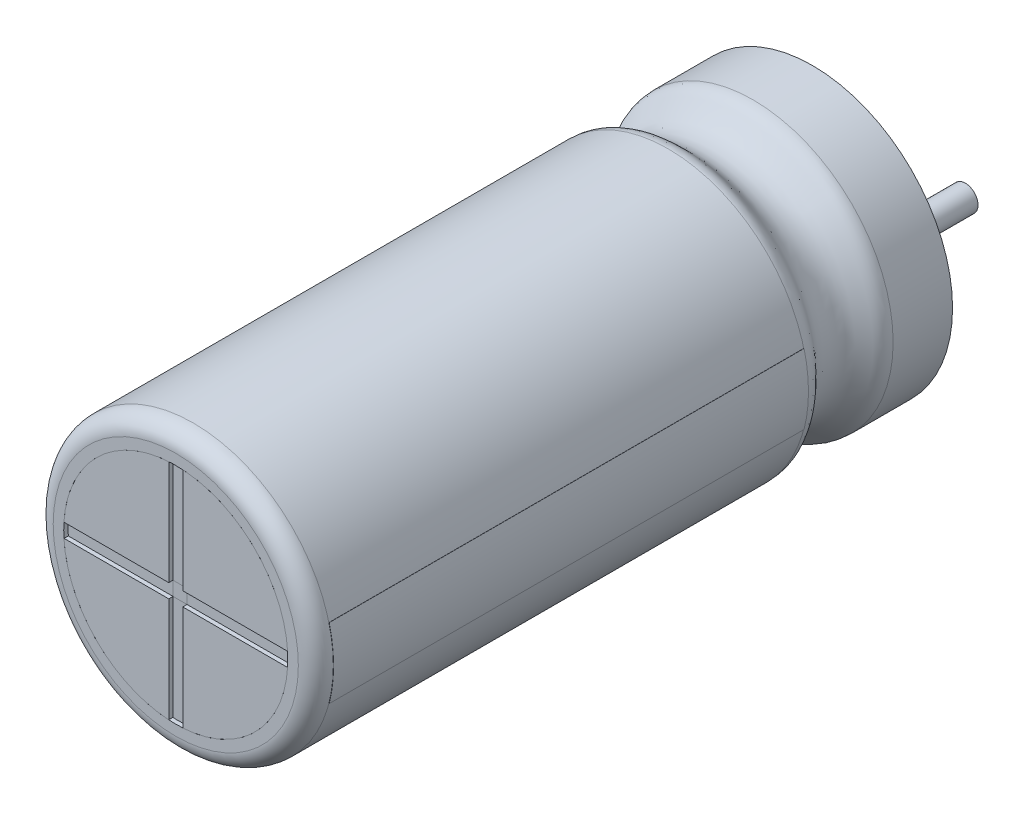
ISO-10303-21;
HEADER;
FILE_DESCRIPTION(('STEP AP214'),'2;1');
FILE_NAME('part.step','',(''),(''),'','','');
FILE_SCHEMA(('AUTOMOTIVE_DESIGN { 1 0 10303 214 1 1 1 1 }'));
ENDSEC;
DATA;
#1=APPLICATION_CONTEXT('core data for automotive mechanical design processes');
#2=APPLICATION_PROTOCOL_DEFINITION('international standard','automotive_design',2000,#1);
#3=PRODUCT_CONTEXT('',#1,'mechanical');
#4=PRODUCT('Part','Part','',(#3));
#5=PRODUCT_RELATED_PRODUCT_CATEGORY('part','',(#4));
#6=PRODUCT_DEFINITION_FORMATION('','',#4);
#7=PRODUCT_DEFINITION_CONTEXT('part definition',#1,'design');
#8=PRODUCT_DEFINITION('design','',#6,#7);
#9=PRODUCT_DEFINITION_SHAPE('','',#8);
#10=(LENGTH_UNIT() NAMED_UNIT(*) SI_UNIT(.MILLI.,.METRE.));
#11=(NAMED_UNIT(*) PLANE_ANGLE_UNIT() SI_UNIT($,.RADIAN.));
#12=(NAMED_UNIT(*) SI_UNIT($,.STERADIAN.) SOLID_ANGLE_UNIT());
#13=UNCERTAINTY_MEASURE_WITH_UNIT(LENGTH_MEASURE(1.E-05),#10,'distance_accuracy_value','');
#14=(GEOMETRIC_REPRESENTATION_CONTEXT(3) GLOBAL_UNCERTAINTY_ASSIGNED_CONTEXT((#13)) GLOBAL_UNIT_ASSIGNED_CONTEXT((#10,
#11,#12)) REPRESENTATION_CONTEXT('',''));
#15=CARTESIAN_POINT('',(0.,0.,0.));
#16=DIRECTION('',(0.,0.,1.));
#17=DIRECTION('',(1.,0.,0.));
#18=AXIS2_PLACEMENT_3D('',#15,#16,#17);
#19=CARTESIAN_POINT('',(-1.,0.,0.));
#20=DIRECTION('',(0.,0.,-1.));
#21=DIRECTION('',(0.,-1.,0.));
#22=AXIS2_PLACEMENT_3D('',#19,#20,#21);
#23=PLANE('',#22);
#24=CARTESIAN_POINT('',(-1.,0.,0.));
#25=DIRECTION('',(0.,0.,-1.));
#26=DIRECTION('',(-1.,0.,0.));
#27=AXIS2_PLACEMENT_3D('',#24,#25,#26);
#28=CIRCLE('',#27,0.25);
#29=CARTESIAN_POINT('',(-1.25,0.,0.));
#30=VERTEX_POINT('',#29);
#31=EDGE_CURVE('P0_E11',#30,#30,#28,.T.);
#32=ORIENTED_EDGE('',*,*,#31,.F.);
#33=EDGE_LOOP('',(#32));
#34=FACE_BOUND('',#33,.T.);
#35=ADVANCED_FACE('P0_F16',(#34),#23,.F.);
#36=CARTESIAN_POINT('',(-1.,0.,-2.));
#37=DIRECTION('',(0.,0.,-1.));
#38=DIRECTION('',(0.,-1.,0.));
#39=AXIS2_PLACEMENT_3D('',#36,#37,#38);
#40=PLANE('',#39);
#41=CARTESIAN_POINT('',(-1.,0.,-2.));
#42=DIRECTION('',(0.,0.,-1.));
#43=DIRECTION('',(-1.,0.,0.));
#44=AXIS2_PLACEMENT_3D('',#41,#42,#43);
#45=CIRCLE('',#44,0.25);
#46=CARTESIAN_POINT('',(-1.25,0.,-2.));
#47=VERTEX_POINT('',#46);
#48=EDGE_CURVE('P0_E42',#47,#47,#45,.T.);
#49=ORIENTED_EDGE('',*,*,#48,.T.);
#50=EDGE_LOOP('',(#49));
#51=FACE_BOUND('',#50,.T.);
#52=ADVANCED_FACE('P0_F18',(#51),#40,.T.);
#53=CARTESIAN_POINT('',(-1.,0.,0.));
#54=DIRECTION('',(0.,0.,-1.));
#55=DIRECTION('',(-1.,0.,0.));
#56=AXIS2_PLACEMENT_3D('',#53,#54,#55);
#57=CYLINDRICAL_SURFACE('',#56,0.25);
#58=ORIENTED_EDGE('',*,*,#48,.F.);
#59=DIRECTION('',(0.,0.,-1.));
#60=VECTOR('',#59,1.);
#61=CARTESIAN_POINT('',(-1.25,0.,0.));
#62=LINE('',#61,#60);
#63=EDGE_CURVE('P0_E20',#30,#47,#62,.T.);
#64=ORIENTED_EDGE('',*,*,#63,.F.);
#65=ORIENTED_EDGE('',*,*,#31,.T.);
#66=ORIENTED_EDGE('',*,*,#63,.T.);
#67=EDGE_LOOP('',(#58,#64,#65,#66));
#68=FACE_BOUND('',#67,.T.);
#69=ADVANCED_FACE('P0_F41',(#68),#57,.T.);
#70=CLOSED_SHELL('',(#35,#52,#69));
#71=MANIFOLD_SOLID_BREP('P0_B1',#70);
#72=CARTESIAN_POINT('',(1.,0.,0.));
#73=DIRECTION('',(0.,0.,-1.));
#74=DIRECTION('',(0.,-1.,0.));
#75=AXIS2_PLACEMENT_3D('',#72,#73,#74);
#76=PLANE('',#75);
#77=CARTESIAN_POINT('',(1.,0.,0.));
#78=DIRECTION('',(0.,0.,-1.));
#79=DIRECTION('',(-1.,0.,0.));
#80=AXIS2_PLACEMENT_3D('',#77,#78,#79);
#81=CIRCLE('',#80,0.25);
#82=CARTESIAN_POINT('',(0.75,0.,0.));
#83=VERTEX_POINT('',#82);
#84=EDGE_CURVE('P1_E11',#83,#83,#81,.T.);
#85=ORIENTED_EDGE('',*,*,#84,.F.);
#86=EDGE_LOOP('',(#85));
#87=FACE_BOUND('',#86,.T.);
#88=ADVANCED_FACE('P1_F16',(#87),#76,.F.);
#89=CARTESIAN_POINT('',(1.,0.,-2.));
#90=DIRECTION('',(0.,0.,-1.));
#91=DIRECTION('',(0.,-1.,0.));
#92=AXIS2_PLACEMENT_3D('',#89,#90,#91);
#93=PLANE('',#92);
#94=CARTESIAN_POINT('',(1.,0.,-2.));
#95=DIRECTION('',(0.,0.,-1.));
#96=DIRECTION('',(-1.,0.,0.));
#97=AXIS2_PLACEMENT_3D('',#94,#95,#96);
#98=CIRCLE('',#97,0.25);
#99=CARTESIAN_POINT('',(0.75,0.,-2.));
#100=VERTEX_POINT('',#99);
#101=EDGE_CURVE('P1_E40',#100,#100,#98,.T.);
#102=ORIENTED_EDGE('',*,*,#101,.T.);
#103=EDGE_LOOP('',(#102));
#104=FACE_BOUND('',#103,.T.);
#105=ADVANCED_FACE('P1_F43',(#104),#93,.T.);
#106=CARTESIAN_POINT('',(1.,0.,0.));
#107=DIRECTION('',(0.,0.,-1.));
#108=DIRECTION('',(-1.,0.,0.));
#109=AXIS2_PLACEMENT_3D('',#106,#107,#108);
#110=CYLINDRICAL_SURFACE('',#109,0.25);
#111=ORIENTED_EDGE('',*,*,#101,.F.);
#112=DIRECTION('',(0.,0.,-1.));
#113=VECTOR('',#112,1.);
#114=CARTESIAN_POINT('',(0.75,0.,0.));
#115=LINE('',#114,#113);
#116=EDGE_CURVE('P1_E24',#83,#100,#115,.T.);
#117=ORIENTED_EDGE('',*,*,#116,.F.);
#118=ORIENTED_EDGE('',*,*,#84,.T.);
#119=ORIENTED_EDGE('',*,*,#116,.T.);
#120=EDGE_LOOP('',(#111,#117,#118,#119));
#121=FACE_BOUND('',#120,.T.);
#122=ADVANCED_FACE('P1_F39',(#121),#110,.T.);
#123=CLOSED_SHELL('',(#88,#105,#122));
#124=MANIFOLD_SOLID_BREP('P1_B1',#123);
#125=CARTESIAN_POINT('',(-0.1375,3.25,12.416666666667));
#126=DIRECTION('',(0.,0.,1.));
#127=DIRECTION('',(1.,0.,0.));
#128=AXIS2_PLACEMENT_3D('',#125,#126,#127);
#129=PLANE('',#128);
#130=DIRECTION('',(0.,-1.,0.));
#131=VECTOR('',#130,1.);
#132=CARTESIAN_POINT('',(0.1375,3.25,12.416666666667));
#133=LINE('',#132,#131);
#134=CARTESIAN_POINT('',(0.1375,0.1375,12.416666666667));
#135=VERTEX_POINT('',#134);
#136=CARTESIAN_POINT('',(0.1375,-0.1375,12.416666666667));
#137=VERTEX_POINT('',#136);
#138=EDGE_CURVE('P2_E121',#135,#137,#133,.T.);
#139=ORIENTED_EDGE('',*,*,#138,.F.);
#140=DIRECTION('',(1.,0.,0.));
#141=VECTOR('',#140,1.);
#142=CARTESIAN_POINT('',(-3.25,0.1375,12.416666666667));
#143=LINE('',#142,#141);
#144=CARTESIAN_POINT('',(-0.1375,0.1375,12.416666666667));
#145=VERTEX_POINT('',#144);
#146=EDGE_CURVE('P2_E97',#145,#135,#143,.T.);
#147=ORIENTED_EDGE('',*,*,#146,.F.);
#148=DIRECTION('',(0.,-1.,0.));
#149=VECTOR('',#148,1.);
#150=CARTESIAN_POINT('',(-0.1375,3.25,12.416666666667));
#151=LINE('',#150,#149);
#152=CARTESIAN_POINT('',(-0.1375,-0.1375,12.416666666667));
#153=VERTEX_POINT('',#152);
#154=EDGE_CURVE('P2_E11',#145,#153,#151,.T.);
#155=ORIENTED_EDGE('',*,*,#154,.T.);
#156=DIRECTION('',(1.,0.,0.));
#157=VECTOR('',#156,1.);
#158=CARTESIAN_POINT('',(-3.25,-0.1375,12.416666666667));
#159=LINE('',#158,#157);
#160=EDGE_CURVE('P2_E216',#153,#137,#159,.T.);
#161=ORIENTED_EDGE('',*,*,#160,.T.);
#162=EDGE_LOOP('',(#139,#147,#155,#161));
#163=FACE_BOUND('',#162,.T.);
#164=ADVANCED_FACE('P2_F16',(#163),#129,.T.);
#165=CARTESIAN_POINT('',(-3.25,-0.1375,12.416666666667));
#166=DIRECTION('',(0.,1.,0.));
#167=DIRECTION('',(1.,0.,0.));
#168=AXIS2_PLACEMENT_3D('',#165,#166,#167);
#169=PLANE('',#168);
#170=DIRECTION('',(1.,0.,0.));
#171=VECTOR('',#170,1.);
#172=CARTESIAN_POINT('',(-3.25,-0.1375,12.416666666667));
#173=LINE('',#172,#171);
#174=CARTESIAN_POINT('',(-2.195698920617,-0.1375,12.416666666667));
#175=VERTEX_POINT('',#174);
#176=EDGE_CURVE('P2_E27',#175,#153,#173,.T.);
#177=ORIENTED_EDGE('',*,*,#176,.F.);
#178=DIRECTION('',(0.,0.,1.));
#179=VECTOR('',#178,1.);
#180=CARTESIAN_POINT('',(-2.195698920617,-0.1375,11.5));
#181=LINE('',#180,#179);
#182=CARTESIAN_POINT('',(-2.195698920617,-0.1375,12.5));
#183=VERTEX_POINT('',#182);
#184=EDGE_CURVE('P2_E187',#175,#183,#181,.T.);
#185=ORIENTED_EDGE('',*,*,#184,.T.);
#186=DIRECTION('',(-1.,0.,0.));
#187=VECTOR('',#186,1.);
#188=CARTESIAN_POINT('',(-1.625,-0.1375,12.5));
#189=LINE('',#188,#187);
#190=CARTESIAN_POINT('',(-0.1375,-0.1375,12.5));
#191=VERTEX_POINT('',#190);
#192=EDGE_CURVE('P2_E197',#191,#183,#189,.T.);
#193=ORIENTED_EDGE('',*,*,#192,.F.);
#194=DIRECTION('',(0.,0.,-1.));
#195=VECTOR('',#194,1.);
#196=CARTESIAN_POINT('',(-0.1375,-0.1375,12.416666666667));
#197=LINE('',#196,#195);
#198=EDGE_CURVE('P2_E222',#191,#153,#197,.T.);
#199=ORIENTED_EDGE('',*,*,#198,.T.);
#200=EDGE_LOOP('',(#177,#185,#193,#199));
#201=FACE_BOUND('',#200,.T.);
#202=ADVANCED_FACE('P2_F331',(#201),#169,.T.);
#203=CARTESIAN_POINT('',(0.,0.,11.5));
#204=DIRECTION('',(0.,0.,1.));
#205=DIRECTION('',(1.,0.,0.));
#206=AXIS2_PLACEMENT_3D('',#203,#204,#205);
#207=PLANE('',#206);
#208=CARTESIAN_POINT('',(0.,0.,11.5));
#209=DIRECTION('',(0.,0.,1.));
#210=DIRECTION('',(-1.,0.,0.));
#211=AXIS2_PLACEMENT_3D('',#208,#209,#210);
#212=CIRCLE('',#211,2.2);
#213=CARTESIAN_POINT('',(-2.2,0.,11.5));
#214=VERTEX_POINT('',#213);
#215=EDGE_CURVE('P2_E195',#214,#214,#212,.T.);
#216=ORIENTED_EDGE('',*,*,#215,.F.);
#217=EDGE_LOOP('',(#216));
#218=FACE_BOUND('',#217,.T.);
#219=ADVANCED_FACE('P2_F337',(#218),#207,.F.);
#220=CARTESIAN_POINT('',(-3.25,-0.1375,12.416666666667));
#221=DIRECTION('',(0.,0.,1.));
#222=DIRECTION('',(1.,0.,0.));
#223=AXIS2_PLACEMENT_3D('',#220,#221,#222);
#224=PLANE('',#223);
#225=DIRECTION('',(1.,0.,0.));
#226=VECTOR('',#225,1.);
#227=CARTESIAN_POINT('',(-3.25,0.1375,12.416666666667));
#228=LINE('',#227,#226);
#229=CARTESIAN_POINT('',(-2.195698920617,0.1375,12.416666666667));
#230=VERTEX_POINT('',#229);
#231=EDGE_CURVE('P2_E202',#230,#145,#228,.T.);
#232=ORIENTED_EDGE('',*,*,#231,.F.);
#233=CARTESIAN_POINT('',(0.,0.,12.416666666667));
#234=DIRECTION('',(0.,0.,1.));
#235=DIRECTION('',(-1.,0.,0.));
#236=AXIS2_PLACEMENT_3D('',#233,#234,#235);
#237=CIRCLE('',#236,2.2);
#238=CARTESIAN_POINT('',(-2.2,0.,12.416666666667));
#239=VERTEX_POINT('',#238);
#240=EDGE_CURVE('P2_E243',#230,#239,#237,.T.);
#241=ORIENTED_EDGE('',*,*,#240,.T.);
#242=CARTESIAN_POINT('',(0.,0.,12.416666666667));
#243=DIRECTION('',(0.,0.,1.));
#244=DIRECTION('',(-1.,0.,0.));
#245=AXIS2_PLACEMENT_3D('',#242,#243,#244);
#246=CIRCLE('',#245,2.2);
#247=EDGE_CURVE('P2_E190',#239,#175,#246,.T.);
#248=ORIENTED_EDGE('',*,*,#247,.T.);
#249=ORIENTED_EDGE('',*,*,#176,.T.);
#250=ORIENTED_EDGE('',*,*,#154,.F.);
#251=EDGE_LOOP('',(#232,#241,#248,#249,#250));
#252=FACE_BOUND('',#251,.T.);
#253=ADVANCED_FACE('P2_F367',(#252),#224,.T.);
#254=CARTESIAN_POINT('',(-3.25,0.1375,12.416666666667));
#255=DIRECTION('',(0.,1.,0.));
#256=DIRECTION('',(1.,0.,0.));
#257=AXIS2_PLACEMENT_3D('',#254,#255,#256);
#258=PLANE('',#257);
#259=DIRECTION('',(0.,0.,-1.));
#260=VECTOR('',#259,1.);
#261=CARTESIAN_POINT('',(-0.1375,0.1375,12.416666666667));
#262=LINE('',#261,#260);
#263=CARTESIAN_POINT('',(-0.1375,0.1375,12.5));
#264=VERTEX_POINT('',#263);
#265=EDGE_CURVE('P2_E276',#264,#145,#262,.T.);
#266=ORIENTED_EDGE('',*,*,#265,.F.);
#267=DIRECTION('',(-1.,0.,0.));
#268=VECTOR('',#267,1.);
#269=CARTESIAN_POINT('',(-1.625,0.1375,12.5));
#270=LINE('',#269,#268);
#271=CARTESIAN_POINT('',(-2.195698920617,0.1375,12.5));
#272=VERTEX_POINT('',#271);
#273=EDGE_CURVE('P2_E20',#264,#272,#270,.T.);
#274=ORIENTED_EDGE('',*,*,#273,.T.);
#275=DIRECTION('',(0.,0.,1.));
#276=VECTOR('',#275,1.);
#277=CARTESIAN_POINT('',(-2.195698920617,0.1375,11.5));
#278=LINE('',#277,#276);
#279=EDGE_CURVE('P2_E236',#230,#272,#278,.T.);
#280=ORIENTED_EDGE('',*,*,#279,.F.);
#281=ORIENTED_EDGE('',*,*,#231,.T.);
#282=EDGE_LOOP('',(#266,#274,#280,#281));
#283=FACE_BOUND('',#282,.T.);
#284=ADVANCED_FACE('P2_F369',(#283),#258,.F.);
#285=CARTESIAN_POINT('',(0.,0.,12.5));
#286=DIRECTION('',(0.,0.,1.));
#287=DIRECTION('',(1.,0.,0.));
#288=AXIS2_PLACEMENT_3D('',#285,#286,#287);
#289=PLANE('',#288);
#290=DIRECTION('',(0.,1.,0.));
#291=VECTOR('',#290,1.);
#292=CARTESIAN_POINT('',(-0.1375,1.625,12.5));
#293=LINE('',#292,#291);
#294=CARTESIAN_POINT('',(-0.1375,2.195698920617,12.5));
#295=VERTEX_POINT('',#294);
#296=EDGE_CURVE('P2_E280',#264,#295,#293,.T.);
#297=ORIENTED_EDGE('',*,*,#296,.T.);
#298=CARTESIAN_POINT('',(0.,0.,12.5));
#299=DIRECTION('',(0.,0.,1.));
#300=DIRECTION('',(-1.,0.,0.));
#301=AXIS2_PLACEMENT_3D('',#298,#299,#300);
#302=CIRCLE('',#301,2.2);
#303=EDGE_CURVE('P2_E233',#295,#272,#302,.T.);
#304=ORIENTED_EDGE('',*,*,#303,.T.);
#305=ORIENTED_EDGE('',*,*,#273,.F.);
#306=EDGE_LOOP('',(#297,#304,#305));
#307=FACE_BOUND('',#306,.T.);
#308=ADVANCED_FACE('P2_F356',(#307),#289,.T.);
#309=CARTESIAN_POINT('',(-0.1375,3.25,12.416666666667));
#310=DIRECTION('',(1.,0.,0.));
#311=DIRECTION('',(0.,-1.,0.));
#312=AXIS2_PLACEMENT_3D('',#309,#310,#311);
#313=PLANE('',#312);
#314=ORIENTED_EDGE('',*,*,#265,.T.);
#315=DIRECTION('',(0.,-1.,0.));
#316=VECTOR('',#315,1.);
#317=CARTESIAN_POINT('',(-0.1375,3.25,12.416666666667));
#318=LINE('',#317,#316);
#319=CARTESIAN_POINT('',(-0.1375,2.195698920617,12.416666666667));
#320=VERTEX_POINT('',#319);
#321=EDGE_CURVE('P2_E239',#320,#145,#318,.T.);
#322=ORIENTED_EDGE('',*,*,#321,.F.);
#323=DIRECTION('',(0.,0.,1.));
#324=VECTOR('',#323,1.);
#325=CARTESIAN_POINT('',(-0.1375,2.195698920617,11.5));
#326=LINE('',#325,#324);
#327=EDGE_CURVE('P2_E183',#320,#295,#326,.T.);
#328=ORIENTED_EDGE('',*,*,#327,.T.);
#329=ORIENTED_EDGE('',*,*,#296,.F.);
#330=EDGE_LOOP('',(#314,#322,#328,#329));
#331=FACE_BOUND('',#330,.T.);
#332=ADVANCED_FACE('P2_F351',(#331),#313,.T.);
#333=CARTESIAN_POINT('',(-0.1375,3.25,12.416666666667));
#334=DIRECTION('',(0.,0.,1.));
#335=DIRECTION('',(1.,0.,0.));
#336=AXIS2_PLACEMENT_3D('',#333,#334,#335);
#337=PLANE('',#336);
#338=DIRECTION('',(0.,-1.,0.));
#339=VECTOR('',#338,1.);
#340=CARTESIAN_POINT('',(0.1375,3.25,12.416666666667));
#341=LINE('',#340,#339);
#342=CARTESIAN_POINT('',(0.1375,2.195698920617,12.416666666667));
#343=VERTEX_POINT('',#342);
#344=EDGE_CURVE('P2_E161',#343,#135,#341,.T.);
#345=ORIENTED_EDGE('',*,*,#344,.F.);
#346=CARTESIAN_POINT('',(0.,0.,12.416666666667));
#347=DIRECTION('',(0.,0.,1.));
#348=DIRECTION('',(-1.,0.,0.));
#349=AXIS2_PLACEMENT_3D('',#346,#347,#348);
#350=CIRCLE('',#349,2.2);
#351=EDGE_CURVE('P2_E177',#343,#320,#350,.T.);
#352=ORIENTED_EDGE('',*,*,#351,.T.);
#353=ORIENTED_EDGE('',*,*,#321,.T.);
#354=ORIENTED_EDGE('',*,*,#146,.T.);
#355=EDGE_LOOP('',(#345,#352,#353,#354));
#356=FACE_BOUND('',#355,.T.);
#357=ADVANCED_FACE('P2_F347',(#356),#337,.T.);
#358=CARTESIAN_POINT('',(0.1375,3.25,12.416666666667));
#359=DIRECTION('',(1.,0.,0.));
#360=DIRECTION('',(0.,-1.,0.));
#361=AXIS2_PLACEMENT_3D('',#358,#359,#360);
#362=PLANE('',#361);
#363=DIRECTION('',(0.,1.,0.));
#364=VECTOR('',#363,1.);
#365=CARTESIAN_POINT('',(0.1375,1.625,12.5));
#366=LINE('',#365,#364);
#367=CARTESIAN_POINT('',(0.1375,0.1375,12.5));
#368=VERTEX_POINT('',#367);
#369=CARTESIAN_POINT('',(0.1375,2.195698920617,12.5));
#370=VERTEX_POINT('',#369);
#371=EDGE_CURVE('P2_E151',#368,#370,#366,.T.);
#372=ORIENTED_EDGE('',*,*,#371,.T.);
#373=DIRECTION('',(0.,0.,1.));
#374=VECTOR('',#373,1.);
#375=CARTESIAN_POINT('',(0.1375,2.195698920617,11.5));
#376=LINE('',#375,#374);
#377=EDGE_CURVE('P2_E154',#343,#370,#376,.T.);
#378=ORIENTED_EDGE('',*,*,#377,.F.);
#379=ORIENTED_EDGE('',*,*,#344,.T.);
#380=DIRECTION('',(0.,0.,-1.));
#381=VECTOR('',#380,1.);
#382=CARTESIAN_POINT('',(0.1375,0.1375,12.416666666667));
#383=LINE('',#382,#381);
#384=EDGE_CURVE('P2_E157',#368,#135,#383,.T.);
#385=ORIENTED_EDGE('',*,*,#384,.F.);
#386=EDGE_LOOP('',(#372,#378,#379,#385));
#387=FACE_BOUND('',#386,.T.);
#388=ADVANCED_FACE('P2_F18',(#387),#362,.F.);
#389=CARTESIAN_POINT('',(0.,0.,12.5));
#390=DIRECTION('',(0.,0.,1.));
#391=DIRECTION('',(1.,0.,0.));
#392=AXIS2_PLACEMENT_3D('',#389,#390,#391);
#393=PLANE('',#392);
#394=DIRECTION('',(-1.,0.,0.));
#395=VECTOR('',#394,1.);
#396=CARTESIAN_POINT('',(-1.625,0.1375,12.5));
#397=LINE('',#396,#395);
#398=CARTESIAN_POINT('',(2.195698920617,0.1375,12.5));
#399=VERTEX_POINT('',#398);
#400=EDGE_CURVE('P2_E166',#399,#368,#397,.T.);
#401=ORIENTED_EDGE('',*,*,#400,.F.);
#402=CARTESIAN_POINT('',(0.,0.,12.5));
#403=DIRECTION('',(0.,0.,1.));
#404=DIRECTION('',(-1.,0.,0.));
#405=AXIS2_PLACEMENT_3D('',#402,#403,#404);
#406=CIRCLE('',#405,2.2);
#407=EDGE_CURVE('P2_E164',#399,#370,#406,.T.);
#408=ORIENTED_EDGE('',*,*,#407,.T.);
#409=ORIENTED_EDGE('',*,*,#371,.F.);
#410=EDGE_LOOP('',(#401,#408,#409));
#411=FACE_BOUND('',#410,.T.);
#412=ADVANCED_FACE('P2_F165',(#411),#393,.T.);
#413=CARTESIAN_POINT('',(-3.25,0.1375,12.416666666667));
#414=DIRECTION('',(0.,1.,0.));
#415=DIRECTION('',(1.,0.,0.));
#416=AXIS2_PLACEMENT_3D('',#413,#414,#415);
#417=PLANE('',#416);
#418=DIRECTION('',(0.,0.,1.));
#419=VECTOR('',#418,1.);
#420=CARTESIAN_POINT('',(2.195698920617,0.1375,11.5));
#421=LINE('',#420,#419);
#422=CARTESIAN_POINT('',(2.195698920617,0.1375,12.416666666667));
#423=VERTEX_POINT('',#422);
#424=EDGE_CURVE('P2_E171',#423,#399,#421,.T.);
#425=ORIENTED_EDGE('',*,*,#424,.T.);
#426=ORIENTED_EDGE('',*,*,#400,.T.);
#427=ORIENTED_EDGE('',*,*,#384,.T.);
#428=DIRECTION('',(1.,0.,0.));
#429=VECTOR('',#428,1.);
#430=CARTESIAN_POINT('',(-3.25,0.1375,12.416666666667));
#431=LINE('',#430,#429);
#432=EDGE_CURVE('P2_E232',#135,#423,#431,.T.);
#433=ORIENTED_EDGE('',*,*,#432,.T.);
#434=EDGE_LOOP('',(#425,#426,#427,#433));
#435=FACE_BOUND('',#434,.T.);
#436=ADVANCED_FACE('P2_F312',(#435),#417,.F.);
#437=CARTESIAN_POINT('',(-3.25,-0.1375,12.416666666667));
#438=DIRECTION('',(0.,0.,1.));
#439=DIRECTION('',(1.,0.,0.));
#440=AXIS2_PLACEMENT_3D('',#437,#438,#439);
#441=PLANE('',#440);
#442=ORIENTED_EDGE('',*,*,#432,.F.);
#443=ORIENTED_EDGE('',*,*,#138,.T.);
#444=DIRECTION('',(1.,0.,0.));
#445=VECTOR('',#444,1.);
#446=CARTESIAN_POINT('',(-3.25,-0.1375,12.416666666667));
#447=LINE('',#446,#445);
#448=CARTESIAN_POINT('',(2.195698920617,-0.1375,12.416666666667));
#449=VERTEX_POINT('',#448);
#450=EDGE_CURVE('P2_E228',#137,#449,#447,.T.);
#451=ORIENTED_EDGE('',*,*,#450,.T.);
#452=CARTESIAN_POINT('',(0.,0.,12.416666666667));
#453=DIRECTION('',(0.,0.,1.));
#454=DIRECTION('',(-1.,0.,0.));
#455=AXIS2_PLACEMENT_3D('',#452,#453,#454);
#456=CIRCLE('',#455,2.2);
#457=EDGE_CURVE('P2_E258',#449,#423,#456,.T.);
#458=ORIENTED_EDGE('',*,*,#457,.T.);
#459=EDGE_LOOP('',(#442,#443,#451,#458));
#460=FACE_BOUND('',#459,.T.);
#461=ADVANCED_FACE('P2_F315',(#460),#441,.T.);
#462=CARTESIAN_POINT('',(-3.25,-0.1375,12.416666666667));
#463=DIRECTION('',(0.,1.,0.));
#464=DIRECTION('',(1.,0.,0.));
#465=AXIS2_PLACEMENT_3D('',#462,#463,#464);
#466=PLANE('',#465);
#467=ORIENTED_EDGE('',*,*,#450,.F.);
#468=DIRECTION('',(0.,0.,-1.));
#469=VECTOR('',#468,1.);
#470=CARTESIAN_POINT('',(0.1375,-0.1375,12.416666666667));
#471=LINE('',#470,#469);
#472=CARTESIAN_POINT('',(0.1375,-0.1375,12.5));
#473=VERTEX_POINT('',#472);
#474=EDGE_CURVE('P2_E229',#473,#137,#471,.T.);
#475=ORIENTED_EDGE('',*,*,#474,.F.);
#476=DIRECTION('',(-1.,0.,0.));
#477=VECTOR('',#476,1.);
#478=CARTESIAN_POINT('',(-1.625,-0.1375,12.5));
#479=LINE('',#478,#477);
#480=CARTESIAN_POINT('',(2.195698920617,-0.1375,12.5));
#481=VERTEX_POINT('',#480);
#482=EDGE_CURVE('P2_E109',#481,#473,#479,.T.);
#483=ORIENTED_EDGE('',*,*,#482,.F.);
#484=DIRECTION('',(0.,0.,1.));
#485=VECTOR('',#484,1.);
#486=CARTESIAN_POINT('',(2.195698920617,-0.1375,11.5));
#487=LINE('',#486,#485);
#488=EDGE_CURVE('P2_E255',#449,#481,#487,.T.);
#489=ORIENTED_EDGE('',*,*,#488,.F.);
#490=EDGE_LOOP('',(#467,#475,#483,#489));
#491=FACE_BOUND('',#490,.T.);
#492=ADVANCED_FACE('P2_F317',(#491),#466,.T.);
#493=CARTESIAN_POINT('',(0.,0.,12.5));
#494=DIRECTION('',(0.,0.,1.));
#495=DIRECTION('',(1.,0.,0.));
#496=AXIS2_PLACEMENT_3D('',#493,#494,#495);
#497=PLANE('',#496);
#498=CARTESIAN_POINT('',(0.,0.,12.5));
#499=DIRECTION('',(0.,0.,1.));
#500=DIRECTION('',(-1.,0.,0.));
#501=AXIS2_PLACEMENT_3D('',#498,#499,#500);
#502=CIRCLE('',#501,2.2);
#503=CARTESIAN_POINT('',(0.1375,-2.195698920617,12.5));
#504=VERTEX_POINT('',#503);
#505=EDGE_CURVE('P2_E211',#504,#481,#502,.T.);
#506=ORIENTED_EDGE('',*,*,#505,.T.);
#507=ORIENTED_EDGE('',*,*,#482,.T.);
#508=DIRECTION('',(0.,1.,0.));
#509=VECTOR('',#508,1.);
#510=CARTESIAN_POINT('',(0.1375,1.625,12.5));
#511=LINE('',#510,#509);
#512=EDGE_CURVE('P2_E220',#504,#473,#511,.T.);
#513=ORIENTED_EDGE('',*,*,#512,.F.);
#514=EDGE_LOOP('',(#506,#507,#513));
#515=FACE_BOUND('',#514,.T.);
#516=ADVANCED_FACE('P2_F324',(#515),#497,.T.);
#517=CARTESIAN_POINT('',(0.1375,3.25,12.416666666667));
#518=DIRECTION('',(1.,0.,0.));
#519=DIRECTION('',(0.,-1.,0.));
#520=AXIS2_PLACEMENT_3D('',#517,#518,#519);
#521=PLANE('',#520);
#522=DIRECTION('',(0.,0.,1.));
#523=VECTOR('',#522,1.);
#524=CARTESIAN_POINT('',(0.1375,-2.195698920617,11.5));
#525=LINE('',#524,#523);
#526=CARTESIAN_POINT('',(0.1375,-2.195698920617,12.416666666667));
#527=VERTEX_POINT('',#526);
#528=EDGE_CURVE('P2_E206',#527,#504,#525,.T.);
#529=ORIENTED_EDGE('',*,*,#528,.T.);
#530=ORIENTED_EDGE('',*,*,#512,.T.);
#531=ORIENTED_EDGE('',*,*,#474,.T.);
#532=DIRECTION('',(0.,-1.,0.));
#533=VECTOR('',#532,1.);
#534=CARTESIAN_POINT('',(0.1375,3.25,12.416666666667));
#535=LINE('',#534,#533);
#536=EDGE_CURVE('P2_E221',#137,#527,#535,.T.);
#537=ORIENTED_EDGE('',*,*,#536,.T.);
#538=EDGE_LOOP('',(#529,#530,#531,#537));
#539=FACE_BOUND('',#538,.T.);
#540=ADVANCED_FACE('P2_F372',(#539),#521,.F.);
#541=CARTESIAN_POINT('',(-0.1375,3.25,12.416666666667));
#542=DIRECTION('',(0.,0.,1.));
#543=DIRECTION('',(1.,0.,0.));
#544=AXIS2_PLACEMENT_3D('',#541,#542,#543);
#545=PLANE('',#544);
#546=ORIENTED_EDGE('',*,*,#536,.F.);
#547=ORIENTED_EDGE('',*,*,#160,.F.);
#548=DIRECTION('',(0.,-1.,0.));
#549=VECTOR('',#548,1.);
#550=CARTESIAN_POINT('',(-0.1375,3.25,12.416666666667));
#551=LINE('',#550,#549);
#552=CARTESIAN_POINT('',(-0.1375,-2.195698920617,12.416666666667));
#553=VERTEX_POINT('',#552);
#554=EDGE_CURVE('P2_E200',#153,#553,#551,.T.);
#555=ORIENTED_EDGE('',*,*,#554,.T.);
#556=CARTESIAN_POINT('',(0.,0.,12.416666666667));
#557=DIRECTION('',(0.,0.,1.));
#558=DIRECTION('',(-1.,0.,0.));
#559=AXIS2_PLACEMENT_3D('',#556,#557,#558);
#560=CIRCLE('',#559,2.2);
#561=EDGE_CURVE('P2_E210',#553,#527,#560,.T.);
#562=ORIENTED_EDGE('',*,*,#561,.T.);
#563=EDGE_LOOP('',(#546,#547,#555,#562));
#564=FACE_BOUND('',#563,.T.);
#565=ADVANCED_FACE('P2_F341',(#564),#545,.T.);
#566=CARTESIAN_POINT('',(-0.1375,3.25,12.416666666667));
#567=DIRECTION('',(1.,0.,0.));
#568=DIRECTION('',(0.,-1.,0.));
#569=AXIS2_PLACEMENT_3D('',#566,#567,#568);
#570=PLANE('',#569);
#571=ORIENTED_EDGE('',*,*,#554,.F.);
#572=ORIENTED_EDGE('',*,*,#198,.F.);
#573=DIRECTION('',(0.,1.,0.));
#574=VECTOR('',#573,1.);
#575=CARTESIAN_POINT('',(-0.1375,1.625,12.5));
#576=LINE('',#575,#574);
#577=CARTESIAN_POINT('',(-0.1375,-2.195698920617,12.5));
#578=VERTEX_POINT('',#577);
#579=EDGE_CURVE('P2_E201',#578,#191,#576,.T.);
#580=ORIENTED_EDGE('',*,*,#579,.F.);
#581=DIRECTION('',(0.,0.,1.));
#582=VECTOR('',#581,1.);
#583=CARTESIAN_POINT('',(-0.1375,-2.195698920617,11.5));
#584=LINE('',#583,#582);
#585=EDGE_CURVE('P2_E212',#553,#578,#584,.T.);
#586=ORIENTED_EDGE('',*,*,#585,.F.);
#587=EDGE_LOOP('',(#571,#572,#580,#586));
#588=FACE_BOUND('',#587,.T.);
#589=ADVANCED_FACE('P2_F363',(#588),#570,.T.);
#590=CARTESIAN_POINT('',(0.,0.,12.5));
#591=DIRECTION('',(0.,0.,1.));
#592=DIRECTION('',(1.,0.,0.));
#593=AXIS2_PLACEMENT_3D('',#590,#591,#592);
#594=PLANE('',#593);
#595=ORIENTED_EDGE('',*,*,#579,.T.);
#596=ORIENTED_EDGE('',*,*,#192,.T.);
#597=CARTESIAN_POINT('',(0.,0.,12.5));
#598=DIRECTION('',(0.,0.,1.));
#599=DIRECTION('',(-1.,0.,0.));
#600=AXIS2_PLACEMENT_3D('',#597,#598,#599);
#601=CIRCLE('',#600,2.2);
#602=EDGE_CURVE('P2_E191',#183,#578,#601,.T.);
#603=ORIENTED_EDGE('',*,*,#602,.T.);
#604=EDGE_LOOP('',(#595,#596,#603));
#605=FACE_BOUND('',#604,.T.);
#606=ADVANCED_FACE('P2_F360',(#605),#594,.T.);
#607=CARTESIAN_POINT('',(0.,0.,11.5));
#608=DIRECTION('',(0.,0.,1.));
#609=DIRECTION('',(-1.,0.,0.));
#610=AXIS2_PLACEMENT_3D('',#607,#608,#609);
#611=CYLINDRICAL_SURFACE('',#610,2.2);
#612=ORIENTED_EDGE('',*,*,#602,.F.);
#613=ORIENTED_EDGE('',*,*,#184,.F.);
#614=ORIENTED_EDGE('',*,*,#247,.F.);
#615=DIRECTION('',(0.,0.,1.));
#616=VECTOR('',#615,1.);
#617=CARTESIAN_POINT('',(-2.2,0.,11.5));
#618=LINE('',#617,#616);
#619=EDGE_CURVE('P2_E192',#214,#239,#618,.T.);
#620=ORIENTED_EDGE('',*,*,#619,.F.);
#621=ORIENTED_EDGE('',*,*,#215,.T.);
#622=ORIENTED_EDGE('',*,*,#619,.T.);
#623=ORIENTED_EDGE('',*,*,#240,.F.);
#624=ORIENTED_EDGE('',*,*,#279,.T.);
#625=ORIENTED_EDGE('',*,*,#303,.F.);
#626=ORIENTED_EDGE('',*,*,#327,.F.);
#627=ORIENTED_EDGE('',*,*,#351,.F.);
#628=ORIENTED_EDGE('',*,*,#377,.T.);
#629=ORIENTED_EDGE('',*,*,#407,.F.);
#630=ORIENTED_EDGE('',*,*,#424,.F.);
#631=ORIENTED_EDGE('',*,*,#457,.F.);
#632=ORIENTED_EDGE('',*,*,#488,.T.);
#633=ORIENTED_EDGE('',*,*,#505,.F.);
#634=ORIENTED_EDGE('',*,*,#528,.F.);
#635=ORIENTED_EDGE('',*,*,#561,.F.);
#636=ORIENTED_EDGE('',*,*,#585,.T.);
#637=EDGE_LOOP('',(#612,#613,#614,#620,#621,#622,#623,#624,#625,#626,#627,#628,#629,#630,#631,
#632,#633,#634,#635,#636));
#638=FACE_BOUND('',#637,.T.);
#639=ADVANCED_FACE('P2_F174',(#638),#611,.T.);
#640=CLOSED_SHELL('',(#164,#202,#219,#253,#284,#308,#332,#357,#388,#412,#436,#461,#492,#516,
#540,#565,#589,#606,#639));
#641=MANIFOLD_SOLID_BREP('P2_B1',#640);
#642=CARTESIAN_POINT('',(0.,0.,11.25));
#643=DIRECTION('',(0.,0.,1.));
#644=DIRECTION('',(1.,0.,0.));
#645=AXIS2_PLACEMENT_3D('',#642,#643,#644);
#646=PLANE('',#645);
#647=CARTESIAN_POINT('',(0.,0.,11.25));
#648=DIRECTION('',(0.,0.,1.));
#649=DIRECTION('',(-1.,0.,0.));
#650=AXIS2_PLACEMENT_3D('',#647,#648,#649);
#651=CIRCLE('',#650,2.2);
#652=CARTESIAN_POINT('',(-2.2,0.,11.25));
#653=VERTEX_POINT('',#652);
#654=EDGE_CURVE('P3_E11',#653,#653,#651,.T.);
#655=ORIENTED_EDGE('',*,*,#654,.T.);
#656=EDGE_LOOP('',(#655));
#657=FACE_BOUND('',#656,.T.);
#658=ADVANCED_FACE('P3_F16',(#657),#646,.T.);
#659=CARTESIAN_POINT('',(0.,0.,11.25));
#660=DIRECTION('',(0.,0.,1.));
#661=DIRECTION('',(-1.,0.,0.));
#662=AXIS2_PLACEMENT_3D('',#659,#660,#661);
#663=CYLINDRICAL_SURFACE('',#662,2.2);
#664=DIRECTION('',(0.,0.,1.));
#665=VECTOR('',#664,1.);
#666=CARTESIAN_POINT('',(-2.2,0.,11.25));
#667=LINE('',#666,#665);
#668=CARTESIAN_POINT('',(-2.2,0.,12.5));
#669=VERTEX_POINT('',#668);
#670=EDGE_CURVE('P3_E27',#653,#669,#667,.T.);
#671=ORIENTED_EDGE('',*,*,#670,.F.);
#672=ORIENTED_EDGE('',*,*,#654,.F.);
#673=ORIENTED_EDGE('',*,*,#670,.T.);
#674=CARTESIAN_POINT('',(0.,0.,12.5));
#675=DIRECTION('',(0.,0.,1.));
#676=DIRECTION('',(-1.,0.,0.));
#677=AXIS2_PLACEMENT_3D('',#674,#675,#676);
#678=CIRCLE('',#677,2.2);
#679=EDGE_CURVE('P3_E98',#669,#669,#678,.T.);
#680=ORIENTED_EDGE('',*,*,#679,.T.);
#681=EDGE_LOOP('',(#671,#672,#673,#680));
#682=FACE_BOUND('',#681,.T.);
#683=ADVANCED_FACE('P3_F133',(#682),#663,.F.);
#684=CARTESIAN_POINT('',(0.,0.,12.5));
#685=DIRECTION('',(0.,0.,1.));
#686=DIRECTION('',(1.,0.,0.));
#687=AXIS2_PLACEMENT_3D('',#684,#685,#686);
#688=PLANE('',#687);
#689=ORIENTED_EDGE('',*,*,#679,.F.);
#690=EDGE_LOOP('',(#689));
#691=FACE_BOUND('',#690,.T.);
#692=CARTESIAN_POINT('',(0.,0.,12.5));
#693=DIRECTION('',(0.,0.,1.));
#694=DIRECTION('',(-1.,0.,0.));
#695=AXIS2_PLACEMENT_3D('',#692,#693,#694);
#696=CIRCLE('',#695,2.40625);
#697=CARTESIAN_POINT('',(-2.40625,0.,12.5));
#698=VERTEX_POINT('',#697);
#699=EDGE_CURVE('P3_E96',#698,#698,#696,.T.);
#700=ORIENTED_EDGE('',*,*,#699,.T.);
#701=EDGE_LOOP('',(#700));
#702=FACE_BOUND('',#701,.T.);
#703=ADVANCED_FACE('P3_F18',(#691,#702),#688,.T.);
#704=CARTESIAN_POINT('',(0.,0.,12.15625));
#705=DIRECTION('',(0.,0.,1.));
#706=DIRECTION('',(-1.,0.,0.));
#707=AXIS2_PLACEMENT_3D('',#704,#705,#706);
#708=TOROIDAL_SURFACE('',#707,2.40625,0.34375);
#709=CARTESIAN_POINT('',(0.,0.,12.15625));
#710=DIRECTION('',(0.,0.,1.));
#711=DIRECTION('',(-1.,0.,0.));
#712=AXIS2_PLACEMENT_3D('',#709,#710,#711);
#713=CIRCLE('',#712,2.75);
#714=CARTESIAN_POINT('',(-2.75,0.,12.15625));
#715=VERTEX_POINT('',#714);
#716=EDGE_CURVE('P3_E95',#715,#715,#713,.T.);
#717=ORIENTED_EDGE('',*,*,#716,.T.);
#718=CARTESIAN_POINT('',(-2.40625,0.,12.15625));
#719=DIRECTION('',(0.,1.,0.));
#720=DIRECTION('',(-1.,0.,0.));
#721=AXIS2_PLACEMENT_3D('',#718,#719,#720);
#722=CIRCLE('',#721,0.34375);
#723=EDGE_CURVE('P3_E56',#715,#698,#722,.T.);
#724=ORIENTED_EDGE('',*,*,#723,.T.);
#725=ORIENTED_EDGE('',*,*,#699,.F.);
#726=ORIENTED_EDGE('',*,*,#723,.F.);
#727=EDGE_LOOP('',(#717,#724,#725,#726));
#728=FACE_BOUND('',#727,.T.);
#729=ADVANCED_FACE('P3_F118',(#728),#708,.T.);
#730=CARTESIAN_POINT('',(0.,0.,2.833333333333));
#731=DIRECTION('',(0.,0.,1.));
#732=DIRECTION('',(-1.,0.,0.));
#733=AXIS2_PLACEMENT_3D('',#730,#731,#732);
#734=CYLINDRICAL_SURFACE('',#733,2.75);
#735=CARTESIAN_POINT('',(0.,0.,2.833333333333));
#736=DIRECTION('',(0.,0.,1.));
#737=DIRECTION('',(-1.,0.,0.));
#738=AXIS2_PLACEMENT_3D('',#735,#736,#737);
#739=CIRCLE('',#738,2.75);
#740=CARTESIAN_POINT('',(-2.75,0.,2.833333333333));
#741=VERTEX_POINT('',#740);
#742=EDGE_CURVE('P3_E103',#741,#741,#739,.T.);
#743=ORIENTED_EDGE('',*,*,#742,.T.);
#744=DIRECTION('',(0.,0.,1.));
#745=VECTOR('',#744,1.);
#746=CARTESIAN_POINT('',(-2.75,0.,2.833333333333));
#747=LINE('',#746,#745);
#748=EDGE_CURVE('P3_E66',#741,#715,#747,.T.);
#749=ORIENTED_EDGE('',*,*,#748,.T.);
#750=ORIENTED_EDGE('',*,*,#716,.F.);
#751=ORIENTED_EDGE('',*,*,#748,.F.);
#752=EDGE_LOOP('',(#743,#749,#750,#751));
#753=FACE_BOUND('',#752,.T.);
#754=ADVANCED_FACE('P3_F119',(#753),#734,.T.);
#755=CARTESIAN_POINT('',(-2.75,0.,1.166666666667));
#756=CARTESIAN_POINT('',(-2.75,0.,1.5));
#757=CARTESIAN_POINT('',(-2.416666666667,0.,1.62732200375));
#758=CARTESIAN_POINT('',(-2.25,0.,1.5));
#759=CARTESIAN_POINT('',(-2.25,0.,2.));
#760=CARTESIAN_POINT('',(-2.25,0.,2.5));
#761=CARTESIAN_POINT('',(-2.416666666667,0.,2.37267799625));
#762=CARTESIAN_POINT('',(-2.75,0.,2.5));
#763=CARTESIAN_POINT('',(-2.75,0.,2.833333333333));
#764=(BOUNDED_CURVE() B_SPLINE_CURVE(8,(#755,#756,#757,#758,#759,#760,#761,#762,#763),
.UNSPECIFIED.,.F.,.F.) B_SPLINE_CURVE_WITH_KNOTS((9,9),(0.,1.),
.UNSPECIFIED.) CURVE() GEOMETRIC_REPRESENTATION_ITEM() RATIONAL_B_SPLINE_CURVE((1.,1.,1.,1.,1.,
1.,1.,1.,1.)) REPRESENTATION_ITEM(''));
#765=CARTESIAN_POINT('',(0.,0.,6.25));
#766=DIRECTION('',(0.,0.,-1.));
#767=AXIS1_PLACEMENT('',#765,#766);
#768=SURFACE_OF_REVOLUTION('',#764,#767);
#769=CARTESIAN_POINT('',(0.,0.,1.166666666667));
#770=DIRECTION('',(0.,0.,1.));
#771=DIRECTION('',(-1.,0.,0.));
#772=AXIS2_PLACEMENT_3D('',#769,#770,#771);
#773=CIRCLE('',#772,2.75);
#774=CARTESIAN_POINT('',(-2.75,0.,1.166666666667));
#775=VERTEX_POINT('',#774);
#776=EDGE_CURVE('P3_E84',#775,#775,#773,.T.);
#777=ORIENTED_EDGE('',*,*,#776,.T.);
#778=CARTESIAN_POINT('',(-2.75,0.,1.166666666667));
#779=CARTESIAN_POINT('',(-2.75,0.,1.5));
#780=CARTESIAN_POINT('',(-2.416666666667,0.,1.62732200375));
#781=CARTESIAN_POINT('',(-2.25,0.,1.5));
#782=CARTESIAN_POINT('',(-2.25,0.,2.));
#783=CARTESIAN_POINT('',(-2.25,0.,2.5));
#784=CARTESIAN_POINT('',(-2.416666666667,0.,2.37267799625));
#785=CARTESIAN_POINT('',(-2.75,0.,2.5));
#786=CARTESIAN_POINT('',(-2.75,0.,2.833333333333));
#787=(BOUNDED_CURVE() B_SPLINE_CURVE(8,(#778,#779,#780,#781,#782,#783,#784,#785,#786),
.UNSPECIFIED.,.F.,.F.) B_SPLINE_CURVE_WITH_KNOTS((9,9),(0.,1.),
.UNSPECIFIED.) CURVE() GEOMETRIC_REPRESENTATION_ITEM() RATIONAL_B_SPLINE_CURVE((1.,1.,1.,1.,1.,
1.,1.,1.,1.)) REPRESENTATION_ITEM(''));
#788=EDGE_CURVE('P3_E74',#775,#741,#787,.T.);
#789=ORIENTED_EDGE('',*,*,#788,.T.);
#790=ORIENTED_EDGE('',*,*,#742,.F.);
#791=ORIENTED_EDGE('',*,*,#788,.F.);
#792=EDGE_LOOP('',(#777,#789,#790,#791));
#793=FACE_BOUND('',#792,.T.);
#794=ADVANCED_FACE('P3_F121',(#793),#768,.F.);
#795=CARTESIAN_POINT('',(0.,0.,0.));
#796=DIRECTION('',(0.,0.,1.));
#797=DIRECTION('',(-1.,0.,0.));
#798=AXIS2_PLACEMENT_3D('',#795,#796,#797);
#799=CYLINDRICAL_SURFACE('',#798,2.75);
#800=CARTESIAN_POINT('',(0.,0.,0.));
#801=DIRECTION('',(0.,0.,1.));
#802=DIRECTION('',(-1.,0.,0.));
#803=AXIS2_PLACEMENT_3D('',#800,#801,#802);
#804=CIRCLE('',#803,2.75);
#805=CARTESIAN_POINT('',(-2.75,0.,0.));
#806=VERTEX_POINT('',#805);
#807=EDGE_CURVE('P3_E20',#806,#806,#804,.T.);
#808=ORIENTED_EDGE('',*,*,#807,.T.);
#809=DIRECTION('',(0.,0.,1.));
#810=VECTOR('',#809,1.);
#811=CARTESIAN_POINT('',(-2.75,0.,0.));
#812=LINE('',#811,#810);
#813=EDGE_CURVE('P3_E81',#806,#775,#812,.T.);
#814=ORIENTED_EDGE('',*,*,#813,.T.);
#815=ORIENTED_EDGE('',*,*,#776,.F.);
#816=ORIENTED_EDGE('',*,*,#813,.F.);
#817=EDGE_LOOP('',(#808,#814,#815,#816));
#818=FACE_BOUND('',#817,.T.);
#819=ADVANCED_FACE('P3_F82',(#818),#799,.T.);
#820=CARTESIAN_POINT('',(0.,0.,0.));
#821=DIRECTION('',(0.,0.,1.));
#822=DIRECTION('',(1.,0.,0.));
#823=AXIS2_PLACEMENT_3D('',#820,#821,#822);
#824=PLANE('',#823);
#825=ORIENTED_EDGE('',*,*,#807,.F.);
#826=EDGE_LOOP('',(#825));
#827=FACE_BOUND('',#826,.T.);
#828=ADVANCED_FACE('P3_F144',(#827),#824,.F.);
#829=CLOSED_SHELL('',(#658,#683,#703,#729,#754,#794,#819,#828));
#830=MANIFOLD_SOLID_BREP('P3_B1',#829);
#831=CARTESIAN_POINT('',(2.6675172797,0.68875,12.15625));
#832=DIRECTION('',(-0.249999999999965,0.968245836551863,0.));
#833=DIRECTION('',(0.,0.,1.));
#834=AXIS2_PLACEMENT_3D('',#831,#832,#833);
#835=PLANE('',#834);
#836=DIRECTION('',(0.,0.,1.));
#837=VECTOR('',#836,1.);
#838=CARTESIAN_POINT('',(2.6675172797,0.68875,2.833333333333));
#839=LINE('',#838,#837);
#840=CARTESIAN_POINT('',(2.6675172797,0.68875,2.833333333333));
#841=VERTEX_POINT('',#840);
#842=CARTESIAN_POINT('',(2.6675172797,0.68875,12.15625));
#843=VERTEX_POINT('',#842);
#844=EDGE_CURVE('P4_E20',#841,#843,#839,.T.);
#845=ORIENTED_EDGE('',*,*,#844,.F.);
#846=DIRECTION('',(0.968245836551863,0.249999999999965,0.));
#847=VECTOR('',#846,1.);
#848=CARTESIAN_POINT('',(2.662676050518,0.6875,2.833333333333));
#849=LINE('',#848,#847);
#850=CARTESIAN_POINT('',(2.662676050518,0.6875,2.833333333333));
#851=VERTEX_POINT('',#850);
#852=EDGE_CURVE('P4_E91',#851,#841,#849,.T.);
#853=ORIENTED_EDGE('',*,*,#852,.F.);
#854=DIRECTION('',(0.,0.,-1.));
#855=VECTOR('',#854,1.);
#856=CARTESIAN_POINT('',(2.662676050518,0.6875,12.15625));
#857=LINE('',#856,#855);
#858=CARTESIAN_POINT('',(2.662676050518,0.6875,12.15625));
#859=VERTEX_POINT('',#858);
#860=EDGE_CURVE('P4_E77',#859,#851,#857,.T.);
#861=ORIENTED_EDGE('',*,*,#860,.F.);
#862=DIRECTION('',(-0.968245836551863,-0.249999999999965,0.));
#863=VECTOR('',#862,1.);
#864=CARTESIAN_POINT('',(2.6675172797,0.68875,12.15625));
#865=LINE('',#864,#863);
#866=EDGE_CURVE('P4_E81',#843,#859,#865,.T.);
#867=ORIENTED_EDGE('',*,*,#866,.F.);
#868=EDGE_LOOP('',(#845,#853,#861,#867));
#869=FACE_BOUND('',#868,.T.);
#870=ADVANCED_FACE('P4_F16',(#869),#835,.T.);
#871=CARTESIAN_POINT('',(2.6675172797,-0.68875,12.15625));
#872=DIRECTION('',(0.249999999999965,0.968245836551863,0.));
#873=DIRECTION('',(0.,0.,-1.));
#874=AXIS2_PLACEMENT_3D('',#871,#872,#873);
#875=PLANE('',#874);
#876=DIRECTION('',(-0.968245836551863,0.249999999999965,0.));
#877=VECTOR('',#876,1.);
#878=CARTESIAN_POINT('',(2.6675172797,-0.68875,12.15625));
#879=LINE('',#878,#877);
#880=CARTESIAN_POINT('',(2.6675172797,-0.68875,12.15625));
#881=VERTEX_POINT('',#880);
#882=CARTESIAN_POINT('',(2.662676050518,-0.6875,12.15625));
#883=VERTEX_POINT('',#882);
#884=EDGE_CURVE('P4_E65',#881,#883,#879,.T.);
#885=ORIENTED_EDGE('',*,*,#884,.T.);
#886=DIRECTION('',(0.,0.,-1.));
#887=VECTOR('',#886,1.);
#888=CARTESIAN_POINT('',(2.662676050518,-0.6875,12.15625));
#889=LINE('',#888,#887);
#890=CARTESIAN_POINT('',(2.662676050518,-0.6875,2.833333333333));
#891=VERTEX_POINT('',#890);
#892=EDGE_CURVE('P4_E92',#883,#891,#889,.T.);
#893=ORIENTED_EDGE('',*,*,#892,.T.);
#894=DIRECTION('',(0.968245836551863,-0.249999999999965,0.));
#895=VECTOR('',#894,1.);
#896=CARTESIAN_POINT('',(2.662676050518,-0.6875,2.833333333333));
#897=LINE('',#896,#895);
#898=CARTESIAN_POINT('',(2.6675172797,-0.68875,2.833333333333));
#899=VERTEX_POINT('',#898);
#900=EDGE_CURVE('P4_E67',#891,#899,#897,.T.);
#901=ORIENTED_EDGE('',*,*,#900,.T.);
#902=DIRECTION('',(0.,0.,1.));
#903=VECTOR('',#902,1.);
#904=CARTESIAN_POINT('',(2.6675172797,-0.68875,2.833333333333));
#905=LINE('',#904,#903);
#906=EDGE_CURVE('P4_E11',#899,#881,#905,.T.);
#907=ORIENTED_EDGE('',*,*,#906,.T.);
#908=EDGE_LOOP('',(#885,#893,#901,#907));
#909=FACE_BOUND('',#908,.T.);
#910=ADVANCED_FACE('P4_F18',(#909),#875,.F.);
#911=CARTESIAN_POINT('',(0.,0.,2.833333333333));
#912=DIRECTION('',(0.,0.,1.));
#913=DIRECTION('',(0.968245836551863,-0.249999999999965,0.));
#914=AXIS2_PLACEMENT_3D('',#911,#912,#913);
#915=CYLINDRICAL_SURFACE('',#914,2.755);
#916=CARTESIAN_POINT('',(0.,0.,2.833333333333));
#917=DIRECTION('',(0.,0.,1.));
#918=DIRECTION('',(0.968245836551863,-0.249999999999965,0.));
#919=AXIS2_PLACEMENT_3D('',#916,#917,#918);
#920=CIRCLE('',#919,2.755);
#921=EDGE_CURVE('P4_E89',#899,#841,#920,.T.);
#922=ORIENTED_EDGE('',*,*,#921,.T.);
#923=ORIENTED_EDGE('',*,*,#844,.T.);
#924=CARTESIAN_POINT('',(0.,0.,12.15625));
#925=DIRECTION('',(0.,0.,1.));
#926=DIRECTION('',(0.968245836551863,-0.249999999999965,0.));
#927=AXIS2_PLACEMENT_3D('',#924,#925,#926);
#928=CIRCLE('',#927,2.755);
#929=EDGE_CURVE('P4_E73',#881,#843,#928,.T.);
#930=ORIENTED_EDGE('',*,*,#929,.F.);
#931=ORIENTED_EDGE('',*,*,#906,.F.);
#932=EDGE_LOOP('',(#922,#923,#930,#931));
#933=FACE_BOUND('',#932,.T.);
#934=ADVANCED_FACE('P4_F78',(#933),#915,.T.);
#935=CARTESIAN_POINT('',(0.,0.,2.833333333333));
#936=DIRECTION('',(0.,0.,1.));
#937=DIRECTION('',(1.,0.,0.));
#938=AXIS2_PLACEMENT_3D('',#935,#936,#937);
#939=PLANE('',#938);
#940=CARTESIAN_POINT('',(0.,0.,2.833333333333));
#941=DIRECTION('',(0.,0.,1.));
#942=DIRECTION('',(0.968245836551863,-0.249999999999965,0.));
#943=AXIS2_PLACEMENT_3D('',#940,#941,#942);
#944=CIRCLE('',#943,2.75);
#945=EDGE_CURVE('P4_E95',#891,#851,#944,.T.);
#946=ORIENTED_EDGE('',*,*,#945,.T.);
#947=ORIENTED_EDGE('',*,*,#852,.T.);
#948=ORIENTED_EDGE('',*,*,#921,.F.);
#949=ORIENTED_EDGE('',*,*,#900,.F.);
#950=EDGE_LOOP('',(#946,#947,#948,#949));
#951=FACE_BOUND('',#950,.T.);
#952=ADVANCED_FACE('P4_F107',(#951),#939,.F.);
#953=CARTESIAN_POINT('',(0.,0.,12.15625));
#954=DIRECTION('',(0.,0.,-1.));
#955=DIRECTION('',(0.968245836551863,-0.249999999999965,0.));
#956=AXIS2_PLACEMENT_3D('',#953,#954,#955);
#957=CYLINDRICAL_SURFACE('',#956,2.75);
#958=CARTESIAN_POINT('',(0.,0.,12.15625));
#959=DIRECTION('',(0.,0.,1.));
#960=DIRECTION('',(0.968245836551863,-0.249999999999965,0.));
#961=AXIS2_PLACEMENT_3D('',#958,#959,#960);
#962=CIRCLE('',#961,2.75);
#963=EDGE_CURVE('P4_E75',#883,#859,#962,.T.);
#964=ORIENTED_EDGE('',*,*,#963,.T.);
#965=ORIENTED_EDGE('',*,*,#860,.T.);
#966=ORIENTED_EDGE('',*,*,#945,.F.);
#967=ORIENTED_EDGE('',*,*,#892,.F.);
#968=EDGE_LOOP('',(#964,#965,#966,#967));
#969=FACE_BOUND('',#968,.T.);
#970=ADVANCED_FACE('P4_F126',(#969),#957,.F.);
#971=CARTESIAN_POINT('',(0.,0.,12.15625));
#972=DIRECTION('',(0.,0.,1.));
#973=DIRECTION('',(1.,0.,0.));
#974=AXIS2_PLACEMENT_3D('',#971,#972,#973);
#975=PLANE('',#974);
#976=ORIENTED_EDGE('',*,*,#929,.T.);
#977=ORIENTED_EDGE('',*,*,#866,.T.);
#978=ORIENTED_EDGE('',*,*,#963,.F.);
#979=ORIENTED_EDGE('',*,*,#884,.F.);
#980=EDGE_LOOP('',(#976,#977,#978,#979));
#981=FACE_BOUND('',#980,.T.);
#982=ADVANCED_FACE('P4_F71',(#981),#975,.T.);
#983=CLOSED_SHELL('',(#870,#910,#934,#952,#970,#982));
#984=MANIFOLD_SOLID_BREP('P4_B1',#983);
#985=ADVANCED_BREP_SHAPE_REPRESENTATION('',(#18,#71,#124,#641,#830,#984),#14);
#986=SHAPE_DEFINITION_REPRESENTATION(#9,#985);
ENDSEC;
END-ISO-10303-21;
